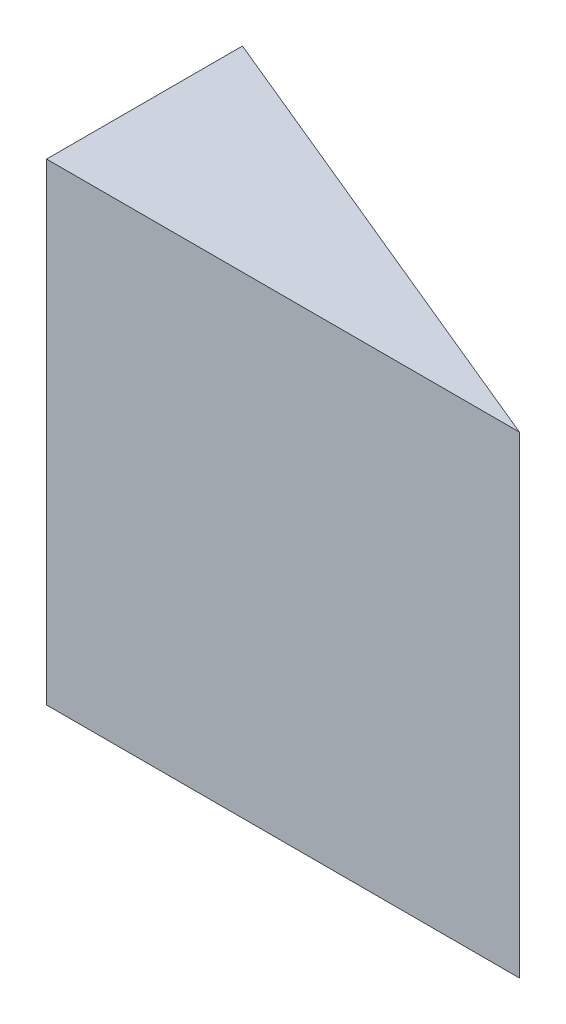
ISO-10303-21;
HEADER;
FILE_DESCRIPTION(('STEP AP214'),'2;1');
FILE_NAME('part.step','',(''),(''),'','','');
FILE_SCHEMA(('AUTOMOTIVE_DESIGN { 1 0 10303 214 1 1 1 1 }'));
ENDSEC;
DATA;
#1=APPLICATION_CONTEXT('core data for automotive mechanical design processes');
#2=APPLICATION_PROTOCOL_DEFINITION('international standard','automotive_design',2000,#1);
#3=PRODUCT_CONTEXT('',#1,'mechanical');
#4=PRODUCT('Part','Part','',(#3));
#5=PRODUCT_RELATED_PRODUCT_CATEGORY('part','',(#4));
#6=PRODUCT_DEFINITION_FORMATION('','',#4);
#7=PRODUCT_DEFINITION_CONTEXT('part definition',#1,'design');
#8=PRODUCT_DEFINITION('design','',#6,#7);
#9=PRODUCT_DEFINITION_SHAPE('','',#8);
#10=(LENGTH_UNIT() NAMED_UNIT(*) SI_UNIT(.MILLI.,.METRE.));
#11=(NAMED_UNIT(*) PLANE_ANGLE_UNIT() SI_UNIT($,.RADIAN.));
#12=(NAMED_UNIT(*) SI_UNIT($,.STERADIAN.) SOLID_ANGLE_UNIT());
#13=UNCERTAINTY_MEASURE_WITH_UNIT(LENGTH_MEASURE(1.E-05),#10,'distance_accuracy_value','');
#14=(GEOMETRIC_REPRESENTATION_CONTEXT(3) GLOBAL_UNCERTAINTY_ASSIGNED_CONTEXT((#13)) GLOBAL_UNIT_ASSIGNED_CONTEXT((#10,
#11,#12)) REPRESENTATION_CONTEXT('',''));
#15=CARTESIAN_POINT('',(0.,0.,0.));
#16=DIRECTION('',(0.,0.,1.));
#17=DIRECTION('',(1.,0.,0.));
#18=AXIS2_PLACEMENT_3D('',#15,#16,#17);
#19=CARTESIAN_POINT('',(-12.7,12.7,13.0829313718964));
#20=DIRECTION('',(1.,0.,0.));
#21=DIRECTION('',(0.,0.,-1.));
#22=AXIS2_PLACEMENT_3D('',#19,#20,#21);
#23=PLANE('',#22);
#24=DIRECTION('',(0.,0.,1.));
#25=VECTOR('',#24,1.);
#26=CARTESIAN_POINT('',(-12.7,-12.7,13.0829313718964));
#27=LINE('',#26,#25);
#28=CARTESIAN_POINT('',(-12.7,-12.7,2.56190688762002));
#29=VERTEX_POINT('',#28);
#30=CARTESIAN_POINT('',(-12.7,-12.7,13.0829313718964));
#31=VERTEX_POINT('',#30);
#32=EDGE_CURVE('E81',#29,#31,#27,.T.);
#33=ORIENTED_EDGE('',*,*,#32,.T.);
#34=DIRECTION('',(0.,-1.,0.));
#35=VECTOR('',#34,1.);
#36=CARTESIAN_POINT('',(-12.7,12.7,13.0829313718964));
#37=LINE('',#36,#35);
#38=CARTESIAN_POINT('',(-12.7,12.7,13.0829313718964));
#39=VERTEX_POINT('',#38);
#40=EDGE_CURVE('E11',#39,#31,#37,.T.);
#41=ORIENTED_EDGE('',*,*,#40,.F.);
#42=DIRECTION('',(0.,0.,1.));
#43=VECTOR('',#42,1.);
#44=CARTESIAN_POINT('',(-12.7,12.7,13.0829313718964));
#45=LINE('',#44,#43);
#46=CARTESIAN_POINT('',(-12.7,12.7,2.56190688762002));
#47=VERTEX_POINT('',#46);
#48=EDGE_CURVE('E74',#47,#39,#45,.T.);
#49=ORIENTED_EDGE('',*,*,#48,.F.);
#50=DIRECTION('',(0.,-1.,0.));
#51=VECTOR('',#50,1.);
#52=CARTESIAN_POINT('',(-12.7,12.7,2.56190688762002));
#53=LINE('',#52,#51);
#54=EDGE_CURVE('E82',#47,#29,#53,.T.);
#55=ORIENTED_EDGE('',*,*,#54,.T.);
#56=EDGE_LOOP('',(#33,#41,#49,#55));
#57=FACE_BOUND('',#56,.T.);
#58=ADVANCED_FACE('F34',(#57),#23,.F.);
#59=CARTESIAN_POINT('',(-12.7,12.7,13.0829313718964));
#60=DIRECTION('',(0.,0.,-1.));
#61=DIRECTION('',(-1.,0.,0.));
#62=AXIS2_PLACEMENT_3D('',#59,#60,#61);
#63=PLANE('',#62);
#64=DIRECTION('',(1.,0.,0.));
#65=VECTOR('',#64,1.);
#66=CARTESIAN_POINT('',(-12.7,-12.7,13.0829313718964));
#67=LINE('',#66,#65);
#68=CARTESIAN_POINT('',(12.7,-12.7,13.0829313718964));
#69=VERTEX_POINT('',#68);
#70=EDGE_CURVE('E62',#31,#69,#67,.T.);
#71=ORIENTED_EDGE('',*,*,#70,.T.);
#72=DIRECTION('',(0.,-1.,0.));
#73=VECTOR('',#72,1.);
#74=CARTESIAN_POINT('',(12.7,12.7,13.0829313718964));
#75=LINE('',#74,#73);
#76=CARTESIAN_POINT('',(12.7,12.7,13.0829313718964));
#77=VERTEX_POINT('',#76);
#78=EDGE_CURVE('E42',#77,#69,#75,.T.);
#79=ORIENTED_EDGE('',*,*,#78,.F.);
#80=DIRECTION('',(1.,0.,0.));
#81=VECTOR('',#80,1.);
#82=CARTESIAN_POINT('',(-12.7,12.7,13.0829313718964));
#83=LINE('',#82,#81);
#84=EDGE_CURVE('E70',#39,#77,#83,.T.);
#85=ORIENTED_EDGE('',*,*,#84,.F.);
#86=ORIENTED_EDGE('',*,*,#40,.T.);
#87=EDGE_LOOP('',(#71,#79,#85,#86));
#88=FACE_BOUND('',#87,.T.);
#89=ADVANCED_FACE('F71',(#88),#63,.F.);
#90=CARTESIAN_POINT('',(12.7,12.7,13.0829313718964));
#91=DIRECTION('',(-0.382683432365084,0.,0.923879532511289));
#92=DIRECTION('',(0.923879532511289,0.,0.382683432365084));
#93=AXIS2_PLACEMENT_3D('',#90,#91,#92);
#94=PLANE('',#93);
#95=DIRECTION('',(-0.923879532511289,0.,-0.382683432365084));
#96=VECTOR('',#95,1.);
#97=CARTESIAN_POINT('',(12.7,-12.7,13.0829313718964));
#98=LINE('',#97,#96);
#99=EDGE_CURVE('E67',#69,#29,#98,.T.);
#100=ORIENTED_EDGE('',*,*,#99,.T.);
#101=ORIENTED_EDGE('',*,*,#54,.F.);
#102=DIRECTION('',(-0.923879532511289,0.,-0.382683432365084));
#103=VECTOR('',#102,1.);
#104=CARTESIAN_POINT('',(12.7,12.7,13.0829313718964));
#105=LINE('',#104,#103);
#106=EDGE_CURVE('E50',#77,#47,#105,.T.);
#107=ORIENTED_EDGE('',*,*,#106,.F.);
#108=ORIENTED_EDGE('',*,*,#78,.T.);
#109=EDGE_LOOP('',(#100,#101,#107,#108));
#110=FACE_BOUND('',#109,.T.);
#111=ADVANCED_FACE('F89',(#110),#94,.F.);
#112=CARTESIAN_POINT('',(0.,12.7,0.));
#113=DIRECTION('',(0.,-1.,0.));
#114=DIRECTION('',(0.,0.,-1.));
#115=AXIS2_PLACEMENT_3D('',#112,#113,#114);
#116=PLANE('',#115);
#117=ORIENTED_EDGE('',*,*,#48,.T.);
#118=ORIENTED_EDGE('',*,*,#84,.T.);
#119=ORIENTED_EDGE('',*,*,#106,.T.);
#120=EDGE_LOOP('',(#117,#118,#119));
#121=FACE_BOUND('',#120,.T.);
#122=ADVANCED_FACE('F77',(#121),#116,.F.);
#123=CARTESIAN_POINT('',(0.,-12.7,0.));
#124=DIRECTION('',(0.,-1.,0.));
#125=DIRECTION('',(0.,0.,-1.));
#126=AXIS2_PLACEMENT_3D('',#123,#124,#125);
#127=PLANE('',#126);
#128=ORIENTED_EDGE('',*,*,#32,.F.);
#129=ORIENTED_EDGE('',*,*,#99,.F.);
#130=ORIENTED_EDGE('',*,*,#70,.F.);
#131=EDGE_LOOP('',(#128,#129,#130));
#132=FACE_BOUND('',#131,.T.);
#133=ADVANCED_FACE('F90',(#132),#127,.T.);
#134=CLOSED_SHELL('',(#58,#89,#111,#122,#133));
#135=MANIFOLD_SOLID_BREP('B2',#134);
#136=ADVANCED_BREP_SHAPE_REPRESENTATION('',(#18,#135),#14);
#137=SHAPE_DEFINITION_REPRESENTATION(#9,#136);
ENDSEC;
END-ISO-10303-21;
